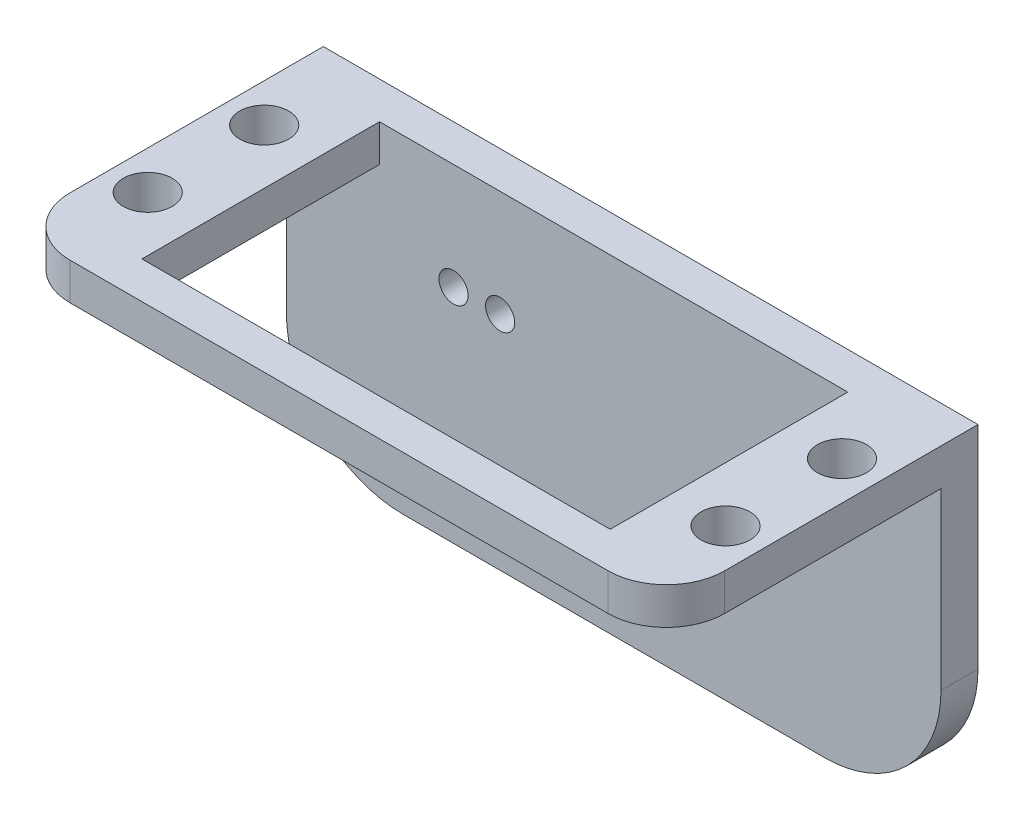
ISO-10303-21;
HEADER;
FILE_DESCRIPTION(('STEP AP214'),'2;1');
FILE_NAME('part.step','',(''),(''),'','','');
FILE_SCHEMA(('AUTOMOTIVE_DESIGN { 1 0 10303 214 1 1 1 1 }'));
ENDSEC;
DATA;
#1=APPLICATION_CONTEXT('core data for automotive mechanical design processes');
#2=APPLICATION_PROTOCOL_DEFINITION('international standard','automotive_design',2000,#1);
#3=PRODUCT_CONTEXT('',#1,'mechanical');
#4=PRODUCT('Part','Part','',(#3));
#5=PRODUCT_RELATED_PRODUCT_CATEGORY('part','',(#4));
#6=PRODUCT_DEFINITION_FORMATION('','',#4);
#7=PRODUCT_DEFINITION_CONTEXT('part definition',#1,'design');
#8=PRODUCT_DEFINITION('design','',#6,#7);
#9=PRODUCT_DEFINITION_SHAPE('','',#8);
#10=(LENGTH_UNIT() NAMED_UNIT(*) SI_UNIT(.MILLI.,.METRE.));
#11=(NAMED_UNIT(*) PLANE_ANGLE_UNIT() SI_UNIT($,.RADIAN.));
#12=(NAMED_UNIT(*) SI_UNIT($,.STERADIAN.) SOLID_ANGLE_UNIT());
#13=UNCERTAINTY_MEASURE_WITH_UNIT(LENGTH_MEASURE(1.E-05),#10,'distance_accuracy_value','');
#14=(GEOMETRIC_REPRESENTATION_CONTEXT(3) GLOBAL_UNCERTAINTY_ASSIGNED_CONTEXT((#13)) GLOBAL_UNIT_ASSIGNED_CONTEXT((#10,
#11,#12)) REPRESENTATION_CONTEXT('',''));
#15=CARTESIAN_POINT('',(0.,0.,0.));
#16=DIRECTION('',(0.,0.,1.));
#17=DIRECTION('',(1.,0.,0.));
#18=AXIS2_PLACEMENT_3D('',#15,#16,#17);
#19=CARTESIAN_POINT('',(0.,0.,0.));
#20=DIRECTION('',(0.,1.,0.));
#21=DIRECTION('',(0.,0.,-1.));
#22=AXIS2_PLACEMENT_3D('',#19,#20,#21);
#23=PLANE('',#22);
#24=CARTESIAN_POINT('',(-24.8,0.,4.99999999999998));
#25=DIRECTION('',(0.,-1.,0.));
#26=DIRECTION('',(0.,0.,1.));
#27=AXIS2_PLACEMENT_3D('',#24,#25,#26);
#28=CIRCLE('',#27,2.1);
#29=CARTESIAN_POINT('',(-24.8,0.,7.09999999999998));
#30=VERTEX_POINT('',#29);
#31=EDGE_CURVE('E262',#30,#30,#28,.T.);
#32=ORIENTED_EDGE('',*,*,#31,.F.);
#33=EDGE_LOOP('',(#32));
#34=FACE_BOUND('',#33,.T.);
#35=CARTESIAN_POINT('',(-24.8,0.,-5.00000000000002));
#36=DIRECTION('',(0.,-1.,0.));
#37=DIRECTION('',(0.,0.,1.));
#38=AXIS2_PLACEMENT_3D('',#35,#36,#37);
#39=CIRCLE('',#38,2.1);
#40=CARTESIAN_POINT('',(-24.8,0.,-2.90000000000002));
#41=VERTEX_POINT('',#40);
#42=EDGE_CURVE('E269',#41,#41,#39,.T.);
#43=ORIENTED_EDGE('',*,*,#42,.F.);
#44=EDGE_LOOP('',(#43));
#45=FACE_BOUND('',#44,.T.);
#46=CARTESIAN_POINT('',(24.8,0.,-5.00000000000001));
#47=DIRECTION('',(0.,-1.,0.));
#48=DIRECTION('',(0.,0.,-1.));
#49=AXIS2_PLACEMENT_3D('',#46,#47,#48);
#50=CIRCLE('',#49,2.1);
#51=CARTESIAN_POINT('',(24.8,0.,-7.10000000000001));
#52=VERTEX_POINT('',#51);
#53=EDGE_CURVE('E274',#52,#52,#50,.T.);
#54=ORIENTED_EDGE('',*,*,#53,.F.);
#55=EDGE_LOOP('',(#54));
#56=FACE_BOUND('',#55,.T.);
#57=CARTESIAN_POINT('',(24.8,0.,4.99999999999999));
#58=DIRECTION('',(0.,-1.,0.));
#59=DIRECTION('',(0.,0.,-1.));
#60=AXIS2_PLACEMENT_3D('',#57,#58,#59);
#61=CIRCLE('',#60,2.1);
#62=CARTESIAN_POINT('',(24.8,0.,2.89999999999999));
#63=VERTEX_POINT('',#62);
#64=EDGE_CURVE('E280',#63,#63,#61,.T.);
#65=ORIENTED_EDGE('',*,*,#64,.F.);
#66=EDGE_LOOP('',(#65));
#67=FACE_BOUND('',#66,.T.);
#68=DIRECTION('',(-1.,0.,0.));
#69=VECTOR('',#68,1.);
#70=CARTESIAN_POINT('',(-28.1,0.,13.375));
#71=LINE('',#70,#69);
#72=CARTESIAN_POINT('',(23.1,0.,13.375));
#73=VERTEX_POINT('',#72);
#74=CARTESIAN_POINT('',(-23.1,0.,13.375));
#75=VERTEX_POINT('',#74);
#76=EDGE_CURVE('E157',#73,#75,#71,.T.);
#77=ORIENTED_EDGE('',*,*,#76,.T.);
#78=CARTESIAN_POINT('',(-23.1,0.,8.37499999999999));
#79=DIRECTION('',(0.,-1.,0.));
#80=DIRECTION('',(0.,0.,-1.));
#81=AXIS2_PLACEMENT_3D('',#78,#79,#80);
#82=CIRCLE('',#81,5.);
#83=CARTESIAN_POINT('',(-28.1,0.,8.37499999999999));
#84=VERTEX_POINT('',#83);
#85=EDGE_CURVE('E223',#84,#75,#82,.F.);
#86=ORIENTED_EDGE('',*,*,#85,.F.);
#87=DIRECTION('',(0.,0.,-1.));
#88=VECTOR('',#87,1.);
#89=CARTESIAN_POINT('',(-28.1,0.,13.375));
#90=LINE('',#89,#88);
#91=CARTESIAN_POINT('',(-28.1,0.,-10.2));
#92=VERTEX_POINT('',#91);
#93=EDGE_CURVE('E246',#84,#92,#90,.T.);
#94=ORIENTED_EDGE('',*,*,#93,.T.);
#95=DIRECTION('',(1.,0.,0.));
#96=VECTOR('',#95,1.);
#97=CARTESIAN_POINT('',(28.1,0.,-10.2));
#98=LINE('',#97,#96);
#99=CARTESIAN_POINT('',(-20.1,0.,-10.2));
#100=VERTEX_POINT('',#99);
#101=EDGE_CURVE('E167',#92,#100,#98,.T.);
#102=ORIENTED_EDGE('',*,*,#101,.T.);
#103=DIRECTION('',(0.,0.,-1.));
#104=VECTOR('',#103,1.);
#105=CARTESIAN_POINT('',(-20.1,0.,10.2));
#106=LINE('',#105,#104);
#107=CARTESIAN_POINT('',(-20.1,0.,10.2));
#108=VERTEX_POINT('',#107);
#109=EDGE_CURVE('E292',#108,#100,#106,.T.);
#110=ORIENTED_EDGE('',*,*,#109,.F.);
#111=DIRECTION('',(-1.,0.,0.));
#112=VECTOR('',#111,1.);
#113=CARTESIAN_POINT('',(-20.1,0.,10.2));
#114=LINE('',#113,#112);
#115=CARTESIAN_POINT('',(20.1,0.,10.2));
#116=VERTEX_POINT('',#115);
#117=EDGE_CURVE('E303',#116,#108,#114,.T.);
#118=ORIENTED_EDGE('',*,*,#117,.F.);
#119=DIRECTION('',(0.,0.,1.));
#120=VECTOR('',#119,1.);
#121=CARTESIAN_POINT('',(20.1,0.,10.2));
#122=LINE('',#121,#120);
#123=CARTESIAN_POINT('',(20.1,0.,-10.2));
#124=VERTEX_POINT('',#123);
#125=EDGE_CURVE('E163',#124,#116,#122,.T.);
#126=ORIENTED_EDGE('',*,*,#125,.F.);
#127=CARTESIAN_POINT('',(28.1,0.,-10.2));
#128=VERTEX_POINT('',#127);
#129=EDGE_CURVE('E141',#124,#128,#98,.T.);
#130=ORIENTED_EDGE('',*,*,#129,.T.);
#131=DIRECTION('',(0.,0.,1.));
#132=VECTOR('',#131,1.);
#133=CARTESIAN_POINT('',(28.1,0.,13.375));
#134=LINE('',#133,#132);
#135=CARTESIAN_POINT('',(28.1,0.,8.375));
#136=VERTEX_POINT('',#135);
#137=EDGE_CURVE('E152',#128,#136,#134,.T.);
#138=ORIENTED_EDGE('',*,*,#137,.T.);
#139=CARTESIAN_POINT('',(23.1,0.,8.375));
#140=DIRECTION('',(0.,-1.,0.));
#141=DIRECTION('',(0.,0.,-1.));
#142=AXIS2_PLACEMENT_3D('',#139,#140,#141);
#143=CIRCLE('',#142,5.);
#144=EDGE_CURVE('E226',#73,#136,#143,.F.);
#145=ORIENTED_EDGE('',*,*,#144,.F.);
#146=EDGE_LOOP('',(#77,#86,#94,#102,#110,#118,#126,#130,#138,#145));
#147=FACE_BOUND('',#146,.T.);
#148=ADVANCED_FACE('F35',(#34,#45,#56,#67,#147),#23,.F.);
#149=CARTESIAN_POINT('',(0.,3.175,0.));
#150=DIRECTION('',(0.,1.,0.));
#151=DIRECTION('',(0.,0.,-1.));
#152=AXIS2_PLACEMENT_3D('',#149,#150,#151);
#153=PLANE('',#152);
#154=CARTESIAN_POINT('',(-24.8,3.175,-5.00000000000002));
#155=DIRECTION('',(0.,-1.,0.));
#156=DIRECTION('',(0.,0.,1.));
#157=AXIS2_PLACEMENT_3D('',#154,#155,#156);
#158=CIRCLE('',#157,2.1);
#159=CARTESIAN_POINT('',(-24.8,3.175,-2.90000000000002));
#160=VERTEX_POINT('',#159);
#161=EDGE_CURVE('E271',#160,#160,#158,.T.);
#162=ORIENTED_EDGE('',*,*,#161,.T.);
#163=EDGE_LOOP('',(#162));
#164=FACE_BOUND('',#163,.T.);
#165=CARTESIAN_POINT('',(24.8,3.175,4.99999999999999));
#166=DIRECTION('',(0.,-1.,0.));
#167=DIRECTION('',(0.,0.,-1.));
#168=AXIS2_PLACEMENT_3D('',#165,#166,#167);
#169=CIRCLE('',#168,2.1);
#170=CARTESIAN_POINT('',(24.8,3.175,2.89999999999999));
#171=VERTEX_POINT('',#170);
#172=EDGE_CURVE('E283',#171,#171,#169,.T.);
#173=ORIENTED_EDGE('',*,*,#172,.T.);
#174=EDGE_LOOP('',(#173));
#175=FACE_BOUND('',#174,.T.);
#176=DIRECTION('',(0.,0.,1.));
#177=VECTOR('',#176,1.);
#178=CARTESIAN_POINT('',(28.1,3.175,13.375));
#179=LINE('',#178,#177);
#180=CARTESIAN_POINT('',(28.1,3.175,-13.375));
#181=VERTEX_POINT('',#180);
#182=CARTESIAN_POINT('',(28.1,3.175,8.375));
#183=VERTEX_POINT('',#182);
#184=EDGE_CURVE('E242',#181,#183,#179,.T.);
#185=ORIENTED_EDGE('',*,*,#184,.F.);
#186=DIRECTION('',(1.,0.,0.));
#187=VECTOR('',#186,1.);
#188=CARTESIAN_POINT('',(-28.1,3.175,-13.375));
#189=LINE('',#188,#187);
#190=CARTESIAN_POINT('',(-28.1,3.175,-13.375));
#191=VERTEX_POINT('',#190);
#192=EDGE_CURVE('E244',#191,#181,#189,.T.);
#193=ORIENTED_EDGE('',*,*,#192,.F.);
#194=DIRECTION('',(0.,0.,-1.));
#195=VECTOR('',#194,1.);
#196=CARTESIAN_POINT('',(-28.1,3.175,13.375));
#197=LINE('',#196,#195);
#198=CARTESIAN_POINT('',(-28.1,3.175,8.37499999999999));
#199=VERTEX_POINT('',#198);
#200=EDGE_CURVE('E241',#199,#191,#197,.T.);
#201=ORIENTED_EDGE('',*,*,#200,.F.);
#202=CARTESIAN_POINT('',(-23.1,3.175,8.37499999999999));
#203=DIRECTION('',(0.,-1.,0.));
#204=DIRECTION('',(0.,0.,-1.));
#205=AXIS2_PLACEMENT_3D('',#202,#203,#204);
#206=CIRCLE('',#205,5.);
#207=CARTESIAN_POINT('',(-23.1,3.175,13.375));
#208=VERTEX_POINT('',#207);
#209=EDGE_CURVE('E229',#208,#199,#206,.T.);
#210=ORIENTED_EDGE('',*,*,#209,.F.);
#211=DIRECTION('',(-1.,0.,0.));
#212=VECTOR('',#211,1.);
#213=CARTESIAN_POINT('',(-28.1,3.175,13.375));
#214=LINE('',#213,#212);
#215=CARTESIAN_POINT('',(23.1,3.175,13.375));
#216=VERTEX_POINT('',#215);
#217=EDGE_CURVE('E236',#216,#208,#214,.T.);
#218=ORIENTED_EDGE('',*,*,#217,.F.);
#219=CARTESIAN_POINT('',(23.1,3.175,8.375));
#220=DIRECTION('',(0.,-1.,0.));
#221=DIRECTION('',(0.,0.,-1.));
#222=AXIS2_PLACEMENT_3D('',#219,#220,#221);
#223=CIRCLE('',#222,5.);
#224=EDGE_CURVE('E43',#183,#216,#223,.T.);
#225=ORIENTED_EDGE('',*,*,#224,.F.);
#226=EDGE_LOOP('',(#185,#193,#201,#210,#218,#225));
#227=FACE_BOUND('',#226,.T.);
#228=DIRECTION('',(-1.,0.,0.));
#229=VECTOR('',#228,1.);
#230=CARTESIAN_POINT('',(-20.1,3.175,10.2));
#231=LINE('',#230,#229);
#232=CARTESIAN_POINT('',(20.1,3.175,10.2));
#233=VERTEX_POINT('',#232);
#234=CARTESIAN_POINT('',(-20.1,3.175,10.2));
#235=VERTEX_POINT('',#234);
#236=EDGE_CURVE('E291',#233,#235,#231,.T.);
#237=ORIENTED_EDGE('',*,*,#236,.T.);
#238=DIRECTION('',(0.,0.,-1.));
#239=VECTOR('',#238,1.);
#240=CARTESIAN_POINT('',(-20.1,3.175,10.2));
#241=LINE('',#240,#239);
#242=CARTESIAN_POINT('',(-20.1,3.175,-10.2));
#243=VERTEX_POINT('',#242);
#244=EDGE_CURVE('E295',#235,#243,#241,.T.);
#245=ORIENTED_EDGE('',*,*,#244,.T.);
#246=DIRECTION('',(1.,0.,0.));
#247=VECTOR('',#246,1.);
#248=CARTESIAN_POINT('',(-20.1,3.175,-10.2));
#249=LINE('',#248,#247);
#250=CARTESIAN_POINT('',(20.1,3.175,-10.2));
#251=VERTEX_POINT('',#250);
#252=EDGE_CURVE('E298',#243,#251,#249,.T.);
#253=ORIENTED_EDGE('',*,*,#252,.T.);
#254=DIRECTION('',(0.,0.,1.));
#255=VECTOR('',#254,1.);
#256=CARTESIAN_POINT('',(20.1,3.175,10.2));
#257=LINE('',#256,#255);
#258=EDGE_CURVE('E288',#251,#233,#257,.T.);
#259=ORIENTED_EDGE('',*,*,#258,.T.);
#260=EDGE_LOOP('',(#237,#245,#253,#259));
#261=FACE_BOUND('',#260,.T.);
#262=CARTESIAN_POINT('',(24.8,3.175,-5.00000000000001));
#263=DIRECTION('',(0.,-1.,0.));
#264=DIRECTION('',(0.,0.,-1.));
#265=AXIS2_PLACEMENT_3D('',#262,#263,#264);
#266=CIRCLE('',#265,2.1);
#267=CARTESIAN_POINT('',(24.8,3.175,-7.10000000000001));
#268=VERTEX_POINT('',#267);
#269=EDGE_CURVE('E277',#268,#268,#266,.T.);
#270=ORIENTED_EDGE('',*,*,#269,.T.);
#271=EDGE_LOOP('',(#270));
#272=FACE_BOUND('',#271,.T.);
#273=CARTESIAN_POINT('',(-24.8,3.175,4.99999999999998));
#274=DIRECTION('',(0.,-1.,0.));
#275=DIRECTION('',(0.,0.,1.));
#276=AXIS2_PLACEMENT_3D('',#273,#274,#275);
#277=CIRCLE('',#276,2.1);
#278=CARTESIAN_POINT('',(-24.8,3.175,7.09999999999998));
#279=VERTEX_POINT('',#278);
#280=EDGE_CURVE('E265',#279,#279,#277,.T.);
#281=ORIENTED_EDGE('',*,*,#280,.T.);
#282=EDGE_LOOP('',(#281));
#283=FACE_BOUND('',#282,.T.);
#284=ADVANCED_FACE('F237',(#164,#175,#227,#261,#272,#283),#153,.T.);
#285=CARTESIAN_POINT('',(28.1,3.175,13.375));
#286=DIRECTION('',(-1.,0.,0.));
#287=DIRECTION('',(0.,0.,-1.));
#288=AXIS2_PLACEMENT_3D('',#285,#286,#287);
#289=PLANE('',#288);
#290=ORIENTED_EDGE('',*,*,#137,.F.);
#291=DIRECTION('',(0.,1.,0.));
#292=VECTOR('',#291,1.);
#293=CARTESIAN_POINT('',(28.1,-25.,-10.2));
#294=LINE('',#293,#292);
#295=CARTESIAN_POINT('',(28.1,-15.,-10.2));
#296=VERTEX_POINT('',#295);
#297=EDGE_CURVE('E136',#296,#128,#294,.T.);
#298=ORIENTED_EDGE('',*,*,#297,.F.);
#299=DIRECTION('',(0.,0.,-1.));
#300=VECTOR('',#299,1.);
#301=CARTESIAN_POINT('',(28.1,-15.,13.375));
#302=LINE('',#301,#300);
#303=CARTESIAN_POINT('',(28.1,-15.,-13.375));
#304=VERTEX_POINT('',#303);
#305=EDGE_CURVE('E206',#304,#296,#302,.F.);
#306=ORIENTED_EDGE('',*,*,#305,.F.);
#307=DIRECTION('',(0.,-1.,0.));
#308=VECTOR('',#307,1.);
#309=CARTESIAN_POINT('',(28.1,3.175,-13.375));
#310=LINE('',#309,#308);
#311=EDGE_CURVE('E171',#181,#304,#310,.T.);
#312=ORIENTED_EDGE('',*,*,#311,.F.);
#313=ORIENTED_EDGE('',*,*,#184,.T.);
#314=DIRECTION('',(0.,-1.,0.));
#315=VECTOR('',#314,1.);
#316=CARTESIAN_POINT('',(28.1,3.175,8.375));
#317=LINE('',#316,#315);
#318=EDGE_CURVE('E56',#136,#183,#317,.F.);
#319=ORIENTED_EDGE('',*,*,#318,.F.);
#320=EDGE_LOOP('',(#290,#298,#306,#312,#313,#319));
#321=FACE_BOUND('',#320,.T.);
#322=ADVANCED_FACE('F153',(#321),#289,.F.);
#323=CARTESIAN_POINT('',(-28.1,3.175,13.375));
#324=DIRECTION('',(0.,0.,-1.));
#325=DIRECTION('',(1.,0.,0.));
#326=AXIS2_PLACEMENT_3D('',#323,#324,#325);
#327=PLANE('',#326);
#328=ORIENTED_EDGE('',*,*,#217,.T.);
#329=DIRECTION('',(0.,-1.,0.));
#330=VECTOR('',#329,1.);
#331=CARTESIAN_POINT('',(-23.1,3.175,13.375));
#332=LINE('',#331,#330);
#333=EDGE_CURVE('E219',#75,#208,#332,.F.);
#334=ORIENTED_EDGE('',*,*,#333,.F.);
#335=ORIENTED_EDGE('',*,*,#76,.F.);
#336=DIRECTION('',(0.,-1.,0.));
#337=VECTOR('',#336,1.);
#338=CARTESIAN_POINT('',(23.1,3.175,13.375));
#339=LINE('',#338,#337);
#340=EDGE_CURVE('E221',#216,#73,#339,.T.);
#341=ORIENTED_EDGE('',*,*,#340,.F.);
#342=EDGE_LOOP('',(#328,#334,#335,#341));
#343=FACE_BOUND('',#342,.T.);
#344=ADVANCED_FACE('F373',(#343),#327,.F.);
#345=CARTESIAN_POINT('',(-28.1,3.175,13.375));
#346=DIRECTION('',(1.,0.,0.));
#347=DIRECTION('',(0.,0.,1.));
#348=AXIS2_PLACEMENT_3D('',#345,#346,#347);
#349=PLANE('',#348);
#350=ORIENTED_EDGE('',*,*,#200,.T.);
#351=DIRECTION('',(0.,-1.,0.));
#352=VECTOR('',#351,1.);
#353=CARTESIAN_POINT('',(-28.1,3.175,-13.375));
#354=LINE('',#353,#352);
#355=CARTESIAN_POINT('',(-28.1,-15.,-13.375));
#356=VERTEX_POINT('',#355);
#357=EDGE_CURVE('E165',#191,#356,#354,.T.);
#358=ORIENTED_EDGE('',*,*,#357,.T.);
#359=DIRECTION('',(0.,0.,1.));
#360=VECTOR('',#359,1.);
#361=CARTESIAN_POINT('',(-28.1,-15.,13.375));
#362=LINE('',#361,#360);
#363=CARTESIAN_POINT('',(-28.1,-15.,-10.2));
#364=VERTEX_POINT('',#363);
#365=EDGE_CURVE('E208',#364,#356,#362,.F.);
#366=ORIENTED_EDGE('',*,*,#365,.F.);
#367=DIRECTION('',(0.,1.,0.));
#368=VECTOR('',#367,1.);
#369=CARTESIAN_POINT('',(-28.1,-25.,-10.2));
#370=LINE('',#369,#368);
#371=EDGE_CURVE('E148',#364,#92,#370,.T.);
#372=ORIENTED_EDGE('',*,*,#371,.T.);
#373=ORIENTED_EDGE('',*,*,#93,.F.);
#374=DIRECTION('',(0.,-1.,0.));
#375=VECTOR('',#374,1.);
#376=CARTESIAN_POINT('',(-28.1,3.175,8.37499999999999));
#377=LINE('',#376,#375);
#378=EDGE_CURVE('E11',#199,#84,#377,.T.);
#379=ORIENTED_EDGE('',*,*,#378,.F.);
#380=EDGE_LOOP('',(#350,#358,#366,#372,#373,#379));
#381=FACE_BOUND('',#380,.T.);
#382=ADVANCED_FACE('F258',(#381),#349,.F.);
#383=CARTESIAN_POINT('',(-28.1,3.175,-13.375));
#384=DIRECTION('',(0.,0.,1.));
#385=DIRECTION('',(-1.,0.,0.));
#386=AXIS2_PLACEMENT_3D('',#383,#384,#385);
#387=PLANE('',#386);
#388=CARTESIAN_POINT('',(-9.75,-5.95332929377434,-13.375));
#389=DIRECTION('',(0.,0.,1.));
#390=DIRECTION('',(1.,0.,0.));
#391=AXIS2_PLACEMENT_3D('',#388,#389,#390);
#392=CIRCLE('',#391,1.25);
#393=CARTESIAN_POINT('',(-8.5,-5.95332929377434,-13.375));
#394=VERTEX_POINT('',#393);
#395=EDGE_CURVE('E183',#394,#394,#392,.T.);
#396=ORIENTED_EDGE('',*,*,#395,.T.);
#397=EDGE_LOOP('',(#396));
#398=FACE_BOUND('',#397,.T.);
#399=CARTESIAN_POINT('',(-13.75,-5.95332929377435,-13.375));
#400=DIRECTION('',(0.,0.,1.));
#401=DIRECTION('',(1.,0.,0.));
#402=AXIS2_PLACEMENT_3D('',#399,#400,#401);
#403=CIRCLE('',#402,1.25);
#404=CARTESIAN_POINT('',(-12.5,-5.95332929377435,-13.375));
#405=VERTEX_POINT('',#404);
#406=EDGE_CURVE('E191',#405,#405,#403,.T.);
#407=ORIENTED_EDGE('',*,*,#406,.T.);
#408=EDGE_LOOP('',(#407));
#409=FACE_BOUND('',#408,.T.);
#410=ORIENTED_EDGE('',*,*,#357,.F.);
#411=ORIENTED_EDGE('',*,*,#192,.T.);
#412=ORIENTED_EDGE('',*,*,#311,.T.);
#413=CARTESIAN_POINT('',(18.1,-15.,-13.375));
#414=DIRECTION('',(0.,0.,-1.));
#415=DIRECTION('',(-1.,0.,0.));
#416=AXIS2_PLACEMENT_3D('',#413,#414,#415);
#417=CIRCLE('',#416,10.);
#418=CARTESIAN_POINT('',(18.1,-25.,-13.375));
#419=VERTEX_POINT('',#418);
#420=EDGE_CURVE('E214',#419,#304,#417,.F.);
#421=ORIENTED_EDGE('',*,*,#420,.F.);
#422=DIRECTION('',(-1.,0.,0.));
#423=VECTOR('',#422,1.);
#424=CARTESIAN_POINT('',(28.1,-25.,-13.375));
#425=LINE('',#424,#423);
#426=CARTESIAN_POINT('',(-18.1,-25.,-13.375));
#427=VERTEX_POINT('',#426);
#428=EDGE_CURVE('E175',#419,#427,#425,.T.);
#429=ORIENTED_EDGE('',*,*,#428,.T.);
#430=CARTESIAN_POINT('',(-18.1,-15.,-13.375));
#431=DIRECTION('',(0.,0.,-1.));
#432=DIRECTION('',(-1.,0.,0.));
#433=AXIS2_PLACEMENT_3D('',#430,#431,#432);
#434=CIRCLE('',#433,10.);
#435=EDGE_CURVE('E216',#356,#427,#434,.F.);
#436=ORIENTED_EDGE('',*,*,#435,.F.);
#437=EDGE_LOOP('',(#410,#411,#412,#421,#429,#436));
#438=FACE_BOUND('',#437,.T.);
#439=ADVANCED_FACE('F256',(#398,#409,#438),#387,.F.);
#440=CARTESIAN_POINT('',(20.1,3.175,10.2));
#441=DIRECTION('',(-1.,0.,0.));
#442=DIRECTION('',(0.,0.,-1.));
#443=AXIS2_PLACEMENT_3D('',#440,#441,#442);
#444=PLANE('',#443);
#445=ORIENTED_EDGE('',*,*,#125,.T.);
#446=DIRECTION('',(0.,-1.,0.));
#447=VECTOR('',#446,1.);
#448=CARTESIAN_POINT('',(20.1,3.175,10.2));
#449=LINE('',#448,#447);
#450=EDGE_CURVE('E158',#233,#116,#449,.T.);
#451=ORIENTED_EDGE('',*,*,#450,.F.);
#452=ORIENTED_EDGE('',*,*,#258,.F.);
#453=DIRECTION('',(0.,-1.,0.));
#454=VECTOR('',#453,1.);
#455=CARTESIAN_POINT('',(20.1,3.175,-10.2));
#456=LINE('',#455,#454);
#457=EDGE_CURVE('E301',#251,#124,#456,.T.);
#458=ORIENTED_EDGE('',*,*,#457,.T.);
#459=EDGE_LOOP('',(#445,#451,#452,#458));
#460=FACE_BOUND('',#459,.T.);
#461=ADVANCED_FACE('F317',(#460),#444,.T.);
#462=CARTESIAN_POINT('',(-20.1,3.175,10.2));
#463=DIRECTION('',(0.,0.,-1.));
#464=DIRECTION('',(1.,0.,0.));
#465=AXIS2_PLACEMENT_3D('',#462,#463,#464);
#466=PLANE('',#465);
#467=ORIENTED_EDGE('',*,*,#117,.T.);
#468=DIRECTION('',(0.,-1.,0.));
#469=VECTOR('',#468,1.);
#470=CARTESIAN_POINT('',(-20.1,3.175,10.2));
#471=LINE('',#470,#469);
#472=EDGE_CURVE('E311',#235,#108,#471,.T.);
#473=ORIENTED_EDGE('',*,*,#472,.F.);
#474=ORIENTED_EDGE('',*,*,#236,.F.);
#475=ORIENTED_EDGE('',*,*,#450,.T.);
#476=EDGE_LOOP('',(#467,#473,#474,#475));
#477=FACE_BOUND('',#476,.T.);
#478=ADVANCED_FACE('F314',(#477),#466,.T.);
#479=CARTESIAN_POINT('',(-20.1,3.175,10.2));
#480=DIRECTION('',(1.,0.,0.));
#481=DIRECTION('',(0.,0.,1.));
#482=AXIS2_PLACEMENT_3D('',#479,#480,#481);
#483=PLANE('',#482);
#484=ORIENTED_EDGE('',*,*,#109,.T.);
#485=DIRECTION('',(0.,-1.,0.));
#486=VECTOR('',#485,1.);
#487=CARTESIAN_POINT('',(-20.1,3.175,-10.2));
#488=LINE('',#487,#486);
#489=EDGE_CURVE('E309',#243,#100,#488,.T.);
#490=ORIENTED_EDGE('',*,*,#489,.F.);
#491=ORIENTED_EDGE('',*,*,#244,.F.);
#492=ORIENTED_EDGE('',*,*,#472,.T.);
#493=EDGE_LOOP('',(#484,#490,#491,#492));
#494=FACE_BOUND('',#493,.T.);
#495=ADVANCED_FACE('F319',(#494),#483,.T.);
#496=CARTESIAN_POINT('',(-20.1,3.175,-10.2));
#497=DIRECTION('',(0.,0.,1.));
#498=DIRECTION('',(-1.,0.,0.));
#499=AXIS2_PLACEMENT_3D('',#496,#497,#498);
#500=PLANE('',#499);
#501=CARTESIAN_POINT('',(-9.75,-5.95332929377434,-10.2));
#502=DIRECTION('',(0.,0.,-1.));
#503=DIRECTION('',(-1.,0.,0.));
#504=AXIS2_PLACEMENT_3D('',#501,#502,#503);
#505=CIRCLE('',#504,1.25);
#506=CARTESIAN_POINT('',(-8.5,-5.95332929377434,-10.2));
#507=VERTEX_POINT('',#506);
#508=EDGE_CURVE('E176',#507,#507,#505,.F.);
#509=ORIENTED_EDGE('',*,*,#508,.F.);
#510=EDGE_LOOP('',(#509));
#511=FACE_BOUND('',#510,.T.);
#512=CARTESIAN_POINT('',(-13.75,-5.95332929377435,-10.2));
#513=DIRECTION('',(0.,0.,-1.));
#514=DIRECTION('',(-1.,0.,0.));
#515=AXIS2_PLACEMENT_3D('',#512,#513,#514);
#516=CIRCLE('',#515,1.25);
#517=CARTESIAN_POINT('',(-12.5,-5.95332929377435,-10.2));
#518=VERTEX_POINT('',#517);
#519=EDGE_CURVE('E188',#518,#518,#516,.F.);
#520=ORIENTED_EDGE('',*,*,#519,.F.);
#521=EDGE_LOOP('',(#520));
#522=FACE_BOUND('',#521,.T.);
#523=DIRECTION('',(1.,0.,0.));
#524=VECTOR('',#523,1.);
#525=CARTESIAN_POINT('',(28.1,-25.,-10.2));
#526=LINE('',#525,#524);
#527=CARTESIAN_POINT('',(-18.1,-25.,-10.2));
#528=VERTEX_POINT('',#527);
#529=CARTESIAN_POINT('',(18.1,-25.,-10.2));
#530=VERTEX_POINT('',#529);
#531=EDGE_CURVE('E149',#528,#530,#526,.T.);
#532=ORIENTED_EDGE('',*,*,#531,.T.);
#533=CARTESIAN_POINT('',(18.1,-15.,-10.2));
#534=DIRECTION('',(0.,0.,-1.));
#535=DIRECTION('',(-1.,0.,0.));
#536=AXIS2_PLACEMENT_3D('',#533,#534,#535);
#537=CIRCLE('',#536,10.);
#538=EDGE_CURVE('E144',#296,#530,#537,.T.);
#539=ORIENTED_EDGE('',*,*,#538,.F.);
#540=ORIENTED_EDGE('',*,*,#297,.T.);
#541=ORIENTED_EDGE('',*,*,#129,.F.);
#542=ORIENTED_EDGE('',*,*,#457,.F.);
#543=ORIENTED_EDGE('',*,*,#252,.F.);
#544=ORIENTED_EDGE('',*,*,#489,.T.);
#545=ORIENTED_EDGE('',*,*,#101,.F.);
#546=ORIENTED_EDGE('',*,*,#371,.F.);
#547=CARTESIAN_POINT('',(-18.1,-15.,-10.2));
#548=DIRECTION('',(0.,0.,-1.));
#549=DIRECTION('',(-1.,0.,0.));
#550=AXIS2_PLACEMENT_3D('',#547,#548,#549);
#551=CIRCLE('',#550,10.);
#552=EDGE_CURVE('E198',#528,#364,#551,.T.);
#553=ORIENTED_EDGE('',*,*,#552,.F.);
#554=EDGE_LOOP('',(#532,#539,#540,#541,#542,#543,#544,#545,#546,#553));
#555=FACE_BOUND('',#554,.T.);
#556=ADVANCED_FACE('F139',(#511,#522,#555),#500,.T.);
#557=CARTESIAN_POINT('',(24.8,3.175,4.99999999999999));
#558=DIRECTION('',(0.,-1.,0.));
#559=DIRECTION('',(0.,0.,1.));
#560=AXIS2_PLACEMENT_3D('',#557,#558,#559);
#561=CYLINDRICAL_SURFACE('',#560,2.1);
#562=ORIENTED_EDGE('',*,*,#172,.F.);
#563=EDGE_LOOP('',(#562));
#564=FACE_BOUND('',#563,.T.);
#565=ORIENTED_EDGE('',*,*,#64,.T.);
#566=EDGE_LOOP('',(#565));
#567=FACE_BOUND('',#566,.T.);
#568=ADVANCED_FACE('F346',(#564,#567),#561,.F.);
#569=CARTESIAN_POINT('',(24.8,3.175,-5.00000000000001));
#570=DIRECTION('',(0.,-1.,0.));
#571=DIRECTION('',(0.,0.,1.));
#572=AXIS2_PLACEMENT_3D('',#569,#570,#571);
#573=CYLINDRICAL_SURFACE('',#572,2.1);
#574=ORIENTED_EDGE('',*,*,#269,.F.);
#575=EDGE_LOOP('',(#574));
#576=FACE_BOUND('',#575,.T.);
#577=ORIENTED_EDGE('',*,*,#53,.T.);
#578=EDGE_LOOP('',(#577));
#579=FACE_BOUND('',#578,.T.);
#580=ADVANCED_FACE('F348',(#576,#579),#573,.F.);
#581=CARTESIAN_POINT('',(-24.8,3.175,-5.00000000000002));
#582=DIRECTION('',(0.,-1.,0.));
#583=DIRECTION('',(0.,0.,1.));
#584=AXIS2_PLACEMENT_3D('',#581,#582,#583);
#585=CYLINDRICAL_SURFACE('',#584,2.1);
#586=ORIENTED_EDGE('',*,*,#161,.F.);
#587=EDGE_LOOP('',(#586));
#588=FACE_BOUND('',#587,.T.);
#589=ORIENTED_EDGE('',*,*,#42,.T.);
#590=EDGE_LOOP('',(#589));
#591=FACE_BOUND('',#590,.T.);
#592=ADVANCED_FACE('F333',(#588,#591),#585,.F.);
#593=CARTESIAN_POINT('',(-24.8,3.175,4.99999999999998));
#594=DIRECTION('',(0.,-1.,0.));
#595=DIRECTION('',(0.,0.,1.));
#596=AXIS2_PLACEMENT_3D('',#593,#594,#595);
#597=CYLINDRICAL_SURFACE('',#596,2.1);
#598=ORIENTED_EDGE('',*,*,#280,.F.);
#599=EDGE_LOOP('',(#598));
#600=FACE_BOUND('',#599,.T.);
#601=ORIENTED_EDGE('',*,*,#31,.T.);
#602=EDGE_LOOP('',(#601));
#603=FACE_BOUND('',#602,.T.);
#604=ADVANCED_FACE('F330',(#600,#603),#597,.F.);
#605=CARTESIAN_POINT('',(0.,-25.,0.));
#606=DIRECTION('',(0.,1.,0.));
#607=DIRECTION('',(0.,0.,-1.));
#608=AXIS2_PLACEMENT_3D('',#605,#606,#607);
#609=PLANE('',#608);
#610=ORIENTED_EDGE('',*,*,#428,.F.);
#611=DIRECTION('',(0.,0.,-1.));
#612=VECTOR('',#611,1.);
#613=CARTESIAN_POINT('',(18.1,-25.,0.));
#614=LINE('',#613,#612);
#615=EDGE_CURVE('E164',#530,#419,#614,.T.);
#616=ORIENTED_EDGE('',*,*,#615,.F.);
#617=ORIENTED_EDGE('',*,*,#531,.F.);
#618=DIRECTION('',(0.,0.,1.));
#619=VECTOR('',#618,1.);
#620=CARTESIAN_POINT('',(-18.1,-25.,0.));
#621=LINE('',#620,#619);
#622=EDGE_CURVE('E168',#427,#528,#621,.T.);
#623=ORIENTED_EDGE('',*,*,#622,.F.);
#624=EDGE_LOOP('',(#610,#616,#617,#623));
#625=FACE_BOUND('',#624,.T.);
#626=ADVANCED_FACE('F201',(#625),#609,.F.);
#627=CARTESIAN_POINT('',(-13.75,-5.95332929377435,-6.66446609406726));
#628=DIRECTION('',(0.,0.,-1.));
#629=DIRECTION('',(1.,0.,0.));
#630=AXIS2_PLACEMENT_3D('',#627,#628,#629);
#631=CYLINDRICAL_SURFACE('',#630,1.25);
#632=CARTESIAN_POINT('',(-12.5,-5.95332929377435,-13.375));
#633=CARTESIAN_POINT('',(-12.5,-5.95332929377435,-13.3419270833333));
#634=CARTESIAN_POINT('',(-12.5,-5.95332929377435,-13.3088541666667));
#635=CARTESIAN_POINT('',(-12.5,-5.95332929377435,-13.2427083333333));
#636=CARTESIAN_POINT('',(-12.5,-5.95332929377435,-13.2096354166667));
#637=CARTESIAN_POINT('',(-12.5,-5.95332929377435,-13.1434895833333));
#638=CARTESIAN_POINT('',(-12.5,-5.95332929377435,-13.1104166666667));
#639=CARTESIAN_POINT('',(-12.5,-5.95332929377435,-13.0442708333333));
#640=CARTESIAN_POINT('',(-12.5,-5.95332929377435,-13.0111979166667));
#641=CARTESIAN_POINT('',(-12.5,-5.95332929377435,-12.9450520833333));
#642=CARTESIAN_POINT('',(-12.5,-5.95332929377435,-12.9119791666667));
#643=CARTESIAN_POINT('',(-12.5,-5.95332929377435,-12.8458333333333));
#644=CARTESIAN_POINT('',(-12.5,-5.95332929377435,-12.8127604166667));
#645=CARTESIAN_POINT('',(-12.5,-5.95332929377435,-12.7466145833333));
#646=CARTESIAN_POINT('',(-12.5,-5.95332929377435,-12.7135416666667));
#647=CARTESIAN_POINT('',(-12.5,-5.95332929377435,-12.6473958333333));
#648=CARTESIAN_POINT('',(-12.5,-5.95332929377435,-12.6143229166667));
#649=CARTESIAN_POINT('',(-12.5,-5.95332929377435,-12.5481770833333));
#650=CARTESIAN_POINT('',(-12.5,-5.95332929377435,-12.5151041666667));
#651=CARTESIAN_POINT('',(-12.5,-5.95332929377435,-12.4489583333333));
#652=CARTESIAN_POINT('',(-12.5,-5.95332929377435,-12.4158854166667));
#653=CARTESIAN_POINT('',(-12.5,-5.95332929377435,-12.3497395833333));
#654=CARTESIAN_POINT('',(-12.5,-5.95332929377435,-12.3166666666667));
#655=CARTESIAN_POINT('',(-12.5,-5.95332929377435,-12.2505208333333));
#656=CARTESIAN_POINT('',(-12.5,-5.95332929377435,-12.2174479166667));
#657=CARTESIAN_POINT('',(-12.5,-5.95332929377435,-12.1513020833333));
#658=CARTESIAN_POINT('',(-12.5,-5.95332929377435,-12.1182291666667));
#659=CARTESIAN_POINT('',(-12.5,-5.95332929377435,-12.0520833333333));
#660=CARTESIAN_POINT('',(-12.5,-5.95332929377435,-12.0190104166667));
#661=CARTESIAN_POINT('',(-12.5,-5.95332929377435,-11.9528645833333));
#662=CARTESIAN_POINT('',(-12.5,-5.95332929377435,-11.9197916666667));
#663=CARTESIAN_POINT('',(-12.5,-5.95332929377435,-11.8536458333333));
#664=CARTESIAN_POINT('',(-12.5,-5.95332929377435,-11.8205729166667));
#665=CARTESIAN_POINT('',(-12.5,-5.95332929377435,-11.7544270833333));
#666=CARTESIAN_POINT('',(-12.5,-5.95332929377435,-11.7213541666667));
#667=CARTESIAN_POINT('',(-12.5,-5.95332929377435,-11.6552083333333));
#668=CARTESIAN_POINT('',(-12.5,-5.95332929377435,-11.6221354166667));
#669=CARTESIAN_POINT('',(-12.5,-5.95332929377435,-11.5559895833333));
#670=CARTESIAN_POINT('',(-12.5,-5.95332929377435,-11.5229166666667));
#671=CARTESIAN_POINT('',(-12.5,-5.95332929377435,-11.4567708333333));
#672=CARTESIAN_POINT('',(-12.5,-5.95332929377435,-11.4236979166667));
#673=CARTESIAN_POINT('',(-12.5,-5.95332929377435,-11.3575520833333));
#674=CARTESIAN_POINT('',(-12.5,-5.95332929377435,-11.3244791666667));
#675=CARTESIAN_POINT('',(-12.5,-5.95332929377435,-11.2583333333333));
#676=CARTESIAN_POINT('',(-12.5,-5.95332929377435,-11.2252604166667));
#677=CARTESIAN_POINT('',(-12.5,-5.95332929377435,-11.1591145833333));
#678=CARTESIAN_POINT('',(-12.5,-5.95332929377435,-11.1260416666667));
#679=CARTESIAN_POINT('',(-12.5,-5.95332929377435,-11.0598958333333));
#680=CARTESIAN_POINT('',(-12.5,-5.95332929377435,-11.0268229166667));
#681=CARTESIAN_POINT('',(-12.5,-5.95332929377435,-10.9606770833333));
#682=CARTESIAN_POINT('',(-12.5,-5.95332929377435,-10.9276041666667));
#683=CARTESIAN_POINT('',(-12.5,-5.95332929377435,-10.8614583333333));
#684=CARTESIAN_POINT('',(-12.5,-5.95332929377435,-10.8283854166667));
#685=CARTESIAN_POINT('',(-12.5,-5.95332929377435,-10.7622395833333));
#686=CARTESIAN_POINT('',(-12.5,-5.95332929377435,-10.7291666666667));
#687=CARTESIAN_POINT('',(-12.5,-5.95332929377435,-10.6630208333333));
#688=CARTESIAN_POINT('',(-12.5,-5.95332929377435,-10.6299479166667));
#689=CARTESIAN_POINT('',(-12.5,-5.95332929377435,-10.5638020833333));
#690=CARTESIAN_POINT('',(-12.5,-5.95332929377435,-10.5307291666667));
#691=CARTESIAN_POINT('',(-12.5,-5.95332929377435,-10.4645833333333));
#692=CARTESIAN_POINT('',(-12.5,-5.95332929377435,-10.4315104166667));
#693=CARTESIAN_POINT('',(-12.5,-5.95332929377435,-10.3653645833333));
#694=CARTESIAN_POINT('',(-12.5,-5.95332929377435,-10.3322916666667));
#695=CARTESIAN_POINT('',(-12.5,-5.95332929377435,-10.2661458333333));
#696=CARTESIAN_POINT('',(-12.5,-5.95332929377435,-10.2330729166667));
#697=CARTESIAN_POINT('',(-12.5,-5.95332929377435,-10.2));
#698=B_SPLINE_CURVE_WITH_KNOTS('',3,(#632,#633,#634,#635,#636,#637,#638,#639,#640,#641,#642,
#643,#644,#645,#646,#647,#648,#649,#650,#651,#652,#653,#654,#655,#656,#657,#658,#659,#660,#661,
#662,#663,#664,#665,#666,#667,#668,#669,#670,#671,#672,#673,#674,#675,#676,#677,#678,#679,#680,
#681,#682,#683,#684,#685,#686,#687,#688,#689,#690,#691,#692,#693,#694,#695,#696,#697),
.UNSPECIFIED.,.F.,.F.,(4,2,2,2,2,2,2,2,2,2,2,2,2,2,2,2,2,2,2,2,2,2,2,2,2,2,2,2,2,2,2,2,4),(0.,
0.0992187499999977,0.198437499999999,0.297656249999998,0.396874999999998,0.496093749999999,
0.595312499999999,0.694531249999998,0.793749999999999,0.892968749999997,0.992187499999998,
1.09140625,1.190625,1.28984375,1.3890625,1.48828125,1.5875,1.68671875,1.7859375,1.88515625,
1.984375,2.08359375,2.1828125,2.28203125,2.38125,2.48046875,2.5796875,2.67890624999999,2.778125,
2.87734375,2.97656249999999,3.07578125,3.175),.UNSPECIFIED.);
#699=EDGE_CURVE('BSEAM416',#405,#518,#698,.T.);
#700=ORIENTED_EDGE('',*,*,#406,.F.);
#701=ORIENTED_EDGE('',*,*,#519,.T.);
#702=ORIENTED_EDGE('',*,*,#699,.T.);
#703=ORIENTED_EDGE('',*,*,#699,.F.);
#704=EDGE_LOOP('',(#700,#702,#701,#703));
#705=FACE_BOUND('',#704,.T.);
#706=ADVANCED_FACE('F416',(#705),#631,.F.);
#707=CARTESIAN_POINT('',(-9.75,-5.95332929377434,-6.66446609406726));
#708=DIRECTION('',(0.,0.,-1.));
#709=DIRECTION('',(1.,0.,0.));
#710=AXIS2_PLACEMENT_3D('',#707,#708,#709);
#711=CYLINDRICAL_SURFACE('',#710,1.25);
#712=CARTESIAN_POINT('',(-8.5,-5.95332929377434,-13.375));
#713=CARTESIAN_POINT('',(-8.5,-5.95332929377434,-13.3419270833333));
#714=CARTESIAN_POINT('',(-8.5,-5.95332929377434,-13.3088541666667));
#715=CARTESIAN_POINT('',(-8.5,-5.95332929377434,-13.2427083333333));
#716=CARTESIAN_POINT('',(-8.5,-5.95332929377434,-13.2096354166667));
#717=CARTESIAN_POINT('',(-8.5,-5.95332929377434,-13.1434895833333));
#718=CARTESIAN_POINT('',(-8.5,-5.95332929377434,-13.1104166666667));
#719=CARTESIAN_POINT('',(-8.5,-5.95332929377434,-13.0442708333333));
#720=CARTESIAN_POINT('',(-8.5,-5.95332929377434,-13.0111979166667));
#721=CARTESIAN_POINT('',(-8.5,-5.95332929377434,-12.9450520833333));
#722=CARTESIAN_POINT('',(-8.5,-5.95332929377434,-12.9119791666667));
#723=CARTESIAN_POINT('',(-8.5,-5.95332929377434,-12.8458333333333));
#724=CARTESIAN_POINT('',(-8.5,-5.95332929377434,-12.8127604166667));
#725=CARTESIAN_POINT('',(-8.5,-5.95332929377434,-12.7466145833333));
#726=CARTESIAN_POINT('',(-8.5,-5.95332929377434,-12.7135416666667));
#727=CARTESIAN_POINT('',(-8.5,-5.95332929377434,-12.6473958333333));
#728=CARTESIAN_POINT('',(-8.5,-5.95332929377434,-12.6143229166667));
#729=CARTESIAN_POINT('',(-8.5,-5.95332929377434,-12.5481770833333));
#730=CARTESIAN_POINT('',(-8.5,-5.95332929377434,-12.5151041666667));
#731=CARTESIAN_POINT('',(-8.5,-5.95332929377434,-12.4489583333333));
#732=CARTESIAN_POINT('',(-8.5,-5.95332929377434,-12.4158854166667));
#733=CARTESIAN_POINT('',(-8.5,-5.95332929377434,-12.3497395833333));
#734=CARTESIAN_POINT('',(-8.5,-5.95332929377434,-12.3166666666667));
#735=CARTESIAN_POINT('',(-8.5,-5.95332929377434,-12.2505208333333));
#736=CARTESIAN_POINT('',(-8.5,-5.95332929377434,-12.2174479166667));
#737=CARTESIAN_POINT('',(-8.5,-5.95332929377434,-12.1513020833333));
#738=CARTESIAN_POINT('',(-8.5,-5.95332929377434,-12.1182291666667));
#739=CARTESIAN_POINT('',(-8.5,-5.95332929377434,-12.0520833333333));
#740=CARTESIAN_POINT('',(-8.5,-5.95332929377434,-12.0190104166667));
#741=CARTESIAN_POINT('',(-8.5,-5.95332929377434,-11.9528645833333));
#742=CARTESIAN_POINT('',(-8.5,-5.95332929377434,-11.9197916666667));
#743=CARTESIAN_POINT('',(-8.5,-5.95332929377434,-11.8536458333333));
#744=CARTESIAN_POINT('',(-8.5,-5.95332929377434,-11.8205729166667));
#745=CARTESIAN_POINT('',(-8.5,-5.95332929377434,-11.7544270833333));
#746=CARTESIAN_POINT('',(-8.5,-5.95332929377434,-11.7213541666667));
#747=CARTESIAN_POINT('',(-8.5,-5.95332929377434,-11.6552083333333));
#748=CARTESIAN_POINT('',(-8.5,-5.95332929377434,-11.6221354166667));
#749=CARTESIAN_POINT('',(-8.5,-5.95332929377434,-11.5559895833333));
#750=CARTESIAN_POINT('',(-8.5,-5.95332929377434,-11.5229166666667));
#751=CARTESIAN_POINT('',(-8.5,-5.95332929377434,-11.4567708333333));
#752=CARTESIAN_POINT('',(-8.5,-5.95332929377434,-11.4236979166667));
#753=CARTESIAN_POINT('',(-8.5,-5.95332929377434,-11.3575520833333));
#754=CARTESIAN_POINT('',(-8.5,-5.95332929377434,-11.3244791666667));
#755=CARTESIAN_POINT('',(-8.5,-5.95332929377434,-11.2583333333333));
#756=CARTESIAN_POINT('',(-8.5,-5.95332929377434,-11.2252604166667));
#757=CARTESIAN_POINT('',(-8.5,-5.95332929377434,-11.1591145833333));
#758=CARTESIAN_POINT('',(-8.5,-5.95332929377434,-11.1260416666667));
#759=CARTESIAN_POINT('',(-8.5,-5.95332929377434,-11.0598958333333));
#760=CARTESIAN_POINT('',(-8.5,-5.95332929377434,-11.0268229166667));
#761=CARTESIAN_POINT('',(-8.5,-5.95332929377434,-10.9606770833333));
#762=CARTESIAN_POINT('',(-8.5,-5.95332929377434,-10.9276041666667));
#763=CARTESIAN_POINT('',(-8.5,-5.95332929377434,-10.8614583333333));
#764=CARTESIAN_POINT('',(-8.5,-5.95332929377434,-10.8283854166667));
#765=CARTESIAN_POINT('',(-8.5,-5.95332929377434,-10.7622395833333));
#766=CARTESIAN_POINT('',(-8.5,-5.95332929377434,-10.7291666666667));
#767=CARTESIAN_POINT('',(-8.5,-5.95332929377434,-10.6630208333333));
#768=CARTESIAN_POINT('',(-8.5,-5.95332929377434,-10.6299479166667));
#769=CARTESIAN_POINT('',(-8.5,-5.95332929377434,-10.5638020833333));
#770=CARTESIAN_POINT('',(-8.5,-5.95332929377434,-10.5307291666667));
#771=CARTESIAN_POINT('',(-8.5,-5.95332929377434,-10.4645833333333));
#772=CARTESIAN_POINT('',(-8.5,-5.95332929377434,-10.4315104166667));
#773=CARTESIAN_POINT('',(-8.5,-5.95332929377434,-10.3653645833333));
#774=CARTESIAN_POINT('',(-8.5,-5.95332929377434,-10.3322916666667));
#775=CARTESIAN_POINT('',(-8.5,-5.95332929377434,-10.2661458333333));
#776=CARTESIAN_POINT('',(-8.5,-5.95332929377434,-10.2330729166667));
#777=CARTESIAN_POINT('',(-8.5,-5.95332929377434,-10.2));
#778=B_SPLINE_CURVE_WITH_KNOTS('',3,(#712,#713,#714,#715,#716,#717,#718,#719,#720,#721,#722,
#723,#724,#725,#726,#727,#728,#729,#730,#731,#732,#733,#734,#735,#736,#737,#738,#739,#740,#741,
#742,#743,#744,#745,#746,#747,#748,#749,#750,#751,#752,#753,#754,#755,#756,#757,#758,#759,#760,
#761,#762,#763,#764,#765,#766,#767,#768,#769,#770,#771,#772,#773,#774,#775,#776,#777),
.UNSPECIFIED.,.F.,.F.,(4,2,2,2,2,2,2,2,2,2,2,2,2,2,2,2,2,2,2,2,2,2,2,2,2,2,2,2,2,2,2,2,4),(0.,
0.0992187499999977,0.198437499999999,0.297656249999998,0.396874999999998,0.496093749999999,
0.595312499999999,0.694531249999998,0.793749999999999,0.892968749999997,0.992187499999998,
1.09140625,1.190625,1.28984375,1.3890625,1.48828125,1.5875,1.68671875,1.7859375,1.88515625,
1.984375,2.08359375,2.1828125,2.28203125,2.38125,2.48046875,2.5796875,2.67890624999999,2.778125,
2.87734375,2.97656249999999,3.07578125,3.175),.UNSPECIFIED.);
#779=EDGE_CURVE('BSEAM380',#394,#507,#778,.T.);
#780=ORIENTED_EDGE('',*,*,#395,.F.);
#781=ORIENTED_EDGE('',*,*,#508,.T.);
#782=ORIENTED_EDGE('',*,*,#779,.T.);
#783=ORIENTED_EDGE('',*,*,#779,.F.);
#784=EDGE_LOOP('',(#780,#782,#781,#783));
#785=FACE_BOUND('',#784,.T.);
#786=ADVANCED_FACE('F380',(#785),#711,.F.);
#787=CARTESIAN_POINT('',(-18.1,-15.,0.));
#788=DIRECTION('',(0.,0.,1.));
#789=DIRECTION('',(-1.,0.,0.));
#790=AXIS2_PLACEMENT_3D('',#787,#788,#789);
#791=CYLINDRICAL_SURFACE('',#790,10.);
#792=ORIENTED_EDGE('',*,*,#435,.T.);
#793=ORIENTED_EDGE('',*,*,#622,.T.);
#794=ORIENTED_EDGE('',*,*,#552,.T.);
#795=ORIENTED_EDGE('',*,*,#365,.T.);
#796=EDGE_LOOP('',(#792,#793,#794,#795));
#797=FACE_BOUND('',#796,.T.);
#798=ADVANCED_FACE('F261',(#797),#791,.T.);
#799=CARTESIAN_POINT('',(18.1,-15.,0.));
#800=DIRECTION('',(0.,0.,-1.));
#801=DIRECTION('',(1.,0.,0.));
#802=AXIS2_PLACEMENT_3D('',#799,#800,#801);
#803=CYLINDRICAL_SURFACE('',#802,10.);
#804=ORIENTED_EDGE('',*,*,#538,.T.);
#805=ORIENTED_EDGE('',*,*,#615,.T.);
#806=ORIENTED_EDGE('',*,*,#420,.T.);
#807=ORIENTED_EDGE('',*,*,#305,.T.);
#808=EDGE_LOOP('',(#804,#805,#806,#807));
#809=FACE_BOUND('',#808,.T.);
#810=ADVANCED_FACE('F205',(#809),#803,.T.);
#811=CARTESIAN_POINT('',(23.1,3.175,8.375));
#812=DIRECTION('',(0.,-1.,0.));
#813=DIRECTION('',(0.,0.,1.));
#814=AXIS2_PLACEMENT_3D('',#811,#812,#813);
#815=CYLINDRICAL_SURFACE('',#814,5.);
#816=ORIENTED_EDGE('',*,*,#224,.T.);
#817=ORIENTED_EDGE('',*,*,#340,.T.);
#818=ORIENTED_EDGE('',*,*,#144,.T.);
#819=ORIENTED_EDGE('',*,*,#318,.T.);
#820=EDGE_LOOP('',(#816,#817,#818,#819));
#821=FACE_BOUND('',#820,.T.);
#822=ADVANCED_FACE('F231',(#821),#815,.T.);
#823=CARTESIAN_POINT('',(-23.1,3.175,8.37499999999999));
#824=DIRECTION('',(0.,-1.,0.));
#825=DIRECTION('',(0.,0.,1.));
#826=AXIS2_PLACEMENT_3D('',#823,#824,#825);
#827=CYLINDRICAL_SURFACE('',#826,5.);
#828=ORIENTED_EDGE('',*,*,#209,.T.);
#829=ORIENTED_EDGE('',*,*,#378,.T.);
#830=ORIENTED_EDGE('',*,*,#85,.T.);
#831=ORIENTED_EDGE('',*,*,#333,.T.);
#832=EDGE_LOOP('',(#828,#829,#830,#831));
#833=FACE_BOUND('',#832,.T.);
#834=ADVANCED_FACE('F37',(#833),#827,.T.);
#835=CLOSED_SHELL('',(#148,#284,#322,#344,#382,#439,#461,#478,#495,#556,#568,#580,#592,#604,
#626,#706,#786,#798,#810,#822,#834));
#836=MANIFOLD_SOLID_BREP('B2',#835);
#837=ADVANCED_BREP_SHAPE_REPRESENTATION('',(#18,#836),#14);
#838=SHAPE_DEFINITION_REPRESENTATION(#9,#837);
ENDSEC;
END-ISO-10303-21;
